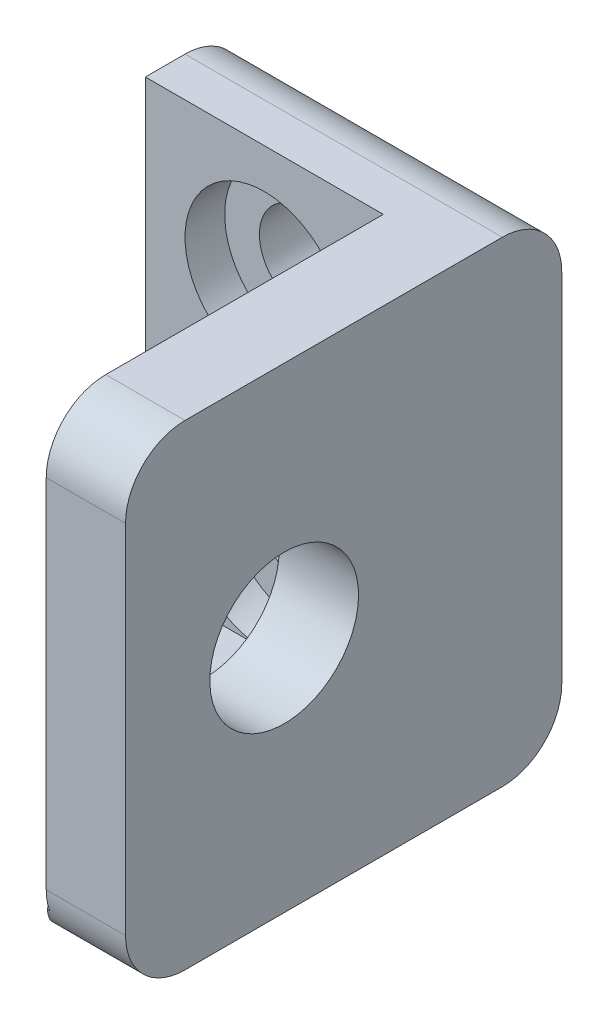
ISO-10303-21;
HEADER;
FILE_DESCRIPTION(('STEP AP214'),'2;1');
FILE_NAME('part.step','',(''),(''),'','','');
FILE_SCHEMA(('AUTOMOTIVE_DESIGN { 1 0 10303 214 1 1 1 1 }'));
ENDSEC;
DATA;
#1=APPLICATION_CONTEXT('core data for automotive mechanical design processes');
#2=APPLICATION_PROTOCOL_DEFINITION('international standard','automotive_design',2000,#1);
#3=PRODUCT_CONTEXT('',#1,'mechanical');
#4=PRODUCT('Part','Part','',(#3));
#5=PRODUCT_RELATED_PRODUCT_CATEGORY('part','',(#4));
#6=PRODUCT_DEFINITION_FORMATION('','',#4);
#7=PRODUCT_DEFINITION_CONTEXT('part definition',#1,'design');
#8=PRODUCT_DEFINITION('design','',#6,#7);
#9=PRODUCT_DEFINITION_SHAPE('','',#8);
#10=(LENGTH_UNIT() NAMED_UNIT(*) SI_UNIT(.MILLI.,.METRE.));
#11=(NAMED_UNIT(*) PLANE_ANGLE_UNIT() SI_UNIT($,.RADIAN.));
#12=(NAMED_UNIT(*) SI_UNIT($,.STERADIAN.) SOLID_ANGLE_UNIT());
#13=UNCERTAINTY_MEASURE_WITH_UNIT(LENGTH_MEASURE(1.E-05),#10,'distance_accuracy_value','');
#14=(GEOMETRIC_REPRESENTATION_CONTEXT(3) GLOBAL_UNCERTAINTY_ASSIGNED_CONTEXT((#13)) GLOBAL_UNIT_ASSIGNED_CONTEXT((#10,
#11,#12)) REPRESENTATION_CONTEXT('',''));
#15=CARTESIAN_POINT('',(0.,0.,0.));
#16=DIRECTION('',(0.,0.,1.));
#17=DIRECTION('',(1.,0.,0.));
#18=AXIS2_PLACEMENT_3D('',#15,#16,#17);
#19=CARTESIAN_POINT('',(-2.,-6.,5.));
#20=DIRECTION('',(0.,0.,-1.));
#21=DIRECTION('',(-1.,0.,0.));
#22=AXIS2_PLACEMENT_3D('',#19,#20,#21);
#23=CYLINDRICAL_SURFACE('',#22,2.25);
#24=CARTESIAN_POINT('',(-2.,-6.,0.));
#25=DIRECTION('',(0.,0.,1.));
#26=DIRECTION('',(1.,0.,0.));
#27=AXIS2_PLACEMENT_3D('',#24,#25,#26);
#28=CIRCLE('',#27,2.25);
#29=CARTESIAN_POINT('',(0.249999999999999,-6.,0.));
#30=VERTEX_POINT('',#29);
#31=EDGE_CURVE('E242',#30,#30,#28,.T.);
#32=ORIENTED_EDGE('',*,*,#31,.F.);
#33=EDGE_LOOP('',(#32));
#34=FACE_BOUND('',#33,.T.);
#35=CARTESIAN_POINT('',(-2.,-6.,3.));
#36=DIRECTION('',(0.,0.,1.));
#37=DIRECTION('',(1.,0.,0.));
#38=AXIS2_PLACEMENT_3D('',#35,#36,#37);
#39=CIRCLE('',#38,2.25);
#40=CARTESIAN_POINT('',(0.249999999999999,-6.,3.));
#41=VERTEX_POINT('',#40);
#42=EDGE_CURVE('E36',#41,#41,#39,.T.);
#43=ORIENTED_EDGE('',*,*,#42,.T.);
#44=EDGE_LOOP('',(#43));
#45=FACE_BOUND('',#44,.T.);
#46=ADVANCED_FACE('F32',(#34,#45),#23,.F.);
#47=CARTESIAN_POINT('',(-2.,6.,5.));
#48=DIRECTION('',(0.,0.,-1.));
#49=DIRECTION('',(-1.,0.,0.));
#50=AXIS2_PLACEMENT_3D('',#47,#48,#49);
#51=CYLINDRICAL_SURFACE('',#50,2.25);
#52=CARTESIAN_POINT('',(-2.,6.,0.));
#53=DIRECTION('',(0.,0.,1.));
#54=DIRECTION('',(1.,0.,0.));
#55=AXIS2_PLACEMENT_3D('',#52,#53,#54);
#56=CIRCLE('',#55,2.25);
#57=CARTESIAN_POINT('',(0.249999999999999,6.,0.));
#58=VERTEX_POINT('',#57);
#59=EDGE_CURVE('E162',#58,#58,#56,.T.);
#60=ORIENTED_EDGE('',*,*,#59,.F.);
#61=EDGE_LOOP('',(#60));
#62=FACE_BOUND('',#61,.T.);
#63=CARTESIAN_POINT('',(-2.,6.,3.));
#64=DIRECTION('',(0.,0.,1.));
#65=DIRECTION('',(1.,0.,0.));
#66=AXIS2_PLACEMENT_3D('',#63,#64,#65);
#67=CIRCLE('',#66,2.25);
#68=CARTESIAN_POINT('',(0.249999999999999,6.,3.));
#69=VERTEX_POINT('',#68);
#70=EDGE_CURVE('E211',#69,#69,#67,.T.);
#71=ORIENTED_EDGE('',*,*,#70,.T.);
#72=EDGE_LOOP('',(#71));
#73=FACE_BOUND('',#72,.T.);
#74=ADVANCED_FACE('F250',(#62,#73),#51,.F.);
#75=CARTESIAN_POINT('',(0.,0.,5.));
#76=DIRECTION('',(0.,0.,-1.));
#77=DIRECTION('',(-1.,0.,0.));
#78=AXIS2_PLACEMENT_3D('',#75,#76,#77);
#79=PLANE('',#78);
#80=CARTESIAN_POINT('',(-2.,6.,5.));
#81=DIRECTION('',(0.,0.,1.));
#82=DIRECTION('',(1.,0.,0.));
#83=AXIS2_PLACEMENT_3D('',#80,#81,#82);
#84=CIRCLE('',#83,4.);
#85=CARTESIAN_POINT('',(2.,6.,5.));
#86=VERTEX_POINT('',#85);
#87=EDGE_CURVE('E219',#86,#86,#84,.T.);
#88=ORIENTED_EDGE('',*,*,#87,.F.);
#89=EDGE_LOOP('',(#88));
#90=FACE_BOUND('',#89,.T.);
#91=DIRECTION('',(1.,0.,0.));
#92=VECTOR('',#91,1.);
#93=CARTESIAN_POINT('',(-8.,-10.,5.));
#94=LINE('',#93,#92);
#95=CARTESIAN_POINT('',(-8.,-10.,5.));
#96=VERTEX_POINT('',#95);
#97=CARTESIAN_POINT('',(-2.,-10.,5.));
#98=VERTEX_POINT('',#97);
#99=EDGE_CURVE('E132',#96,#98,#94,.T.);
#100=ORIENTED_EDGE('',*,*,#99,.T.);
#101=CARTESIAN_POINT('',(-2.,-6.,5.));
#102=DIRECTION('',(0.,0.,1.));
#103=DIRECTION('',(1.,0.,0.));
#104=AXIS2_PLACEMENT_3D('',#101,#102,#103);
#105=CIRCLE('',#104,4.);
#106=EDGE_CURVE('E47',#98,#98,#105,.T.);
#107=ORIENTED_EDGE('',*,*,#106,.F.);
#108=CARTESIAN_POINT('',(4.,-10.,5.));
#109=VERTEX_POINT('',#108);
#110=EDGE_CURVE('E127',#98,#109,#94,.T.);
#111=ORIENTED_EDGE('',*,*,#110,.T.);
#112=DIRECTION('',(0.,1.,0.));
#113=VECTOR('',#112,1.);
#114=CARTESIAN_POINT('',(4.,0.,5.));
#115=LINE('',#114,#113);
#116=CARTESIAN_POINT('',(4.,12.,5.));
#117=VERTEX_POINT('',#116);
#118=EDGE_CURVE('E240',#109,#117,#115,.T.);
#119=ORIENTED_EDGE('',*,*,#118,.T.);
#120=DIRECTION('',(-1.,0.,0.));
#121=VECTOR('',#120,1.);
#122=CARTESIAN_POINT('',(8.,12.,5.));
#123=LINE('',#122,#121);
#124=CARTESIAN_POINT('',(-8.,12.,5.));
#125=VERTEX_POINT('',#124);
#126=EDGE_CURVE('E149',#117,#125,#123,.T.);
#127=ORIENTED_EDGE('',*,*,#126,.T.);
#128=DIRECTION('',(0.,-1.,0.));
#129=VECTOR('',#128,1.);
#130=CARTESIAN_POINT('',(-8.,12.,5.));
#131=LINE('',#130,#129);
#132=EDGE_CURVE('E142',#125,#96,#131,.T.);
#133=ORIENTED_EDGE('',*,*,#132,.T.);
#134=EDGE_LOOP('',(#100,#107,#111,#119,#127,#133));
#135=FACE_BOUND('',#134,.T.);
#136=ADVANCED_FACE('F147',(#90,#135),#79,.F.);
#137=CARTESIAN_POINT('',(0.,0.,0.));
#138=DIRECTION('',(0.,0.,-1.));
#139=DIRECTION('',(-1.,0.,0.));
#140=AXIS2_PLACEMENT_3D('',#137,#138,#139);
#141=PLANE('',#140);
#142=DIRECTION('',(0.,-1.,0.));
#143=VECTOR('',#142,1.);
#144=CARTESIAN_POINT('',(-8.,12.,0.));
#145=LINE('',#144,#143);
#146=CARTESIAN_POINT('',(-8.,9.,0.));
#147=VERTEX_POINT('',#146);
#148=CARTESIAN_POINT('',(-8.,-9.,0.));
#149=VERTEX_POINT('',#148);
#150=EDGE_CURVE('E155',#147,#149,#145,.T.);
#151=ORIENTED_EDGE('',*,*,#150,.F.);
#152=DIRECTION('',(-1.,0.,0.));
#153=VECTOR('',#152,1.);
#154=CARTESIAN_POINT('',(8.,9.00000000000001,0.));
#155=LINE('',#154,#153);
#156=CARTESIAN_POINT('',(8.,9.00000000000001,0.));
#157=VERTEX_POINT('',#156);
#158=EDGE_CURVE('E186',#147,#157,#155,.F.);
#159=ORIENTED_EDGE('',*,*,#158,.T.);
#160=DIRECTION('',(0.,1.,0.));
#161=VECTOR('',#160,1.);
#162=CARTESIAN_POINT('',(8.,12.,0.));
#163=LINE('',#162,#161);
#164=CARTESIAN_POINT('',(8.,-9.,0.));
#165=VERTEX_POINT('',#164);
#166=EDGE_CURVE('E159',#165,#157,#163,.T.);
#167=ORIENTED_EDGE('',*,*,#166,.F.);
#168=DIRECTION('',(1.,0.,0.));
#169=VECTOR('',#168,1.);
#170=CARTESIAN_POINT('',(-8.,-9.,0.));
#171=LINE('',#170,#169);
#172=EDGE_CURVE('E184',#165,#149,#171,.F.);
#173=ORIENTED_EDGE('',*,*,#172,.T.);
#174=EDGE_LOOP('',(#151,#159,#167,#173));
#175=FACE_BOUND('',#174,.T.);
#176=ORIENTED_EDGE('',*,*,#59,.T.);
#177=EDGE_LOOP('',(#176));
#178=FACE_BOUND('',#177,.T.);
#179=ORIENTED_EDGE('',*,*,#31,.T.);
#180=EDGE_LOOP('',(#179));
#181=FACE_BOUND('',#180,.T.);
#182=ADVANCED_FACE('F247',(#175,#178,#181),#141,.T.);
#183=CARTESIAN_POINT('',(8.,12.,5.));
#184=DIRECTION('',(-1.,0.,0.));
#185=DIRECTION('',(0.,-1.,0.));
#186=AXIS2_PLACEMENT_3D('',#183,#184,#185);
#187=PLANE('',#186);
#188=CARTESIAN_POINT('',(8.,0.,14.));
#189=DIRECTION('',(1.,0.,0.));
#190=DIRECTION('',(0.,1.,0.));
#191=AXIS2_PLACEMENT_3D('',#188,#189,#190);
#192=CIRCLE('',#191,3.75);
#193=CARTESIAN_POINT('',(8.,3.75,14.));
#194=VERTEX_POINT('',#193);
#195=EDGE_CURVE('E145',#194,#194,#192,.T.);
#196=ORIENTED_EDGE('',*,*,#195,.F.);
#197=EDGE_LOOP('',(#196));
#198=FACE_BOUND('',#197,.T.);
#199=ORIENTED_EDGE('',*,*,#166,.T.);
#200=CARTESIAN_POINT('',(8.,9.00000000000001,3.));
#201=DIRECTION('',(-1.,0.,0.));
#202=DIRECTION('',(0.,-1.,0.));
#203=AXIS2_PLACEMENT_3D('',#200,#201,#202);
#204=CIRCLE('',#203,3.);
#205=CARTESIAN_POINT('',(8.,12.,3.));
#206=VERTEX_POINT('',#205);
#207=EDGE_CURVE('E194',#157,#206,#204,.F.);
#208=ORIENTED_EDGE('',*,*,#207,.T.);
#209=DIRECTION('',(0.,0.,-1.));
#210=VECTOR('',#209,1.);
#211=CARTESIAN_POINT('',(8.,12.,5.));
#212=LINE('',#211,#210);
#213=CARTESIAN_POINT('',(8.,12.,19.));
#214=VERTEX_POINT('',#213);
#215=EDGE_CURVE('E168',#214,#206,#212,.T.);
#216=ORIENTED_EDGE('',*,*,#215,.F.);
#217=CARTESIAN_POINT('',(8.,9.00000000000001,19.));
#218=DIRECTION('',(-1.,0.,0.));
#219=DIRECTION('',(0.,-1.,0.));
#220=AXIS2_PLACEMENT_3D('',#217,#218,#219);
#221=CIRCLE('',#220,3.);
#222=CARTESIAN_POINT('',(8.,9.00000000000001,22.));
#223=VERTEX_POINT('',#222);
#224=EDGE_CURVE('E192',#214,#223,#221,.F.);
#225=ORIENTED_EDGE('',*,*,#224,.T.);
#226=DIRECTION('',(0.,1.,0.));
#227=VECTOR('',#226,1.);
#228=CARTESIAN_POINT('',(8.,12.,22.));
#229=LINE('',#228,#227);
#230=CARTESIAN_POINT('',(8.,-9.,22.));
#231=VERTEX_POINT('',#230);
#232=EDGE_CURVE('E234',#231,#223,#229,.T.);
#233=ORIENTED_EDGE('',*,*,#232,.F.);
#234=CARTESIAN_POINT('',(8.,-9.,19.));
#235=DIRECTION('',(-1.,0.,0.));
#236=DIRECTION('',(0.,-1.,0.));
#237=AXIS2_PLACEMENT_3D('',#234,#235,#236);
#238=CIRCLE('',#237,3.);
#239=CARTESIAN_POINT('',(8.,-12.,19.));
#240=VERTEX_POINT('',#239);
#241=EDGE_CURVE('E190',#231,#240,#238,.F.);
#242=ORIENTED_EDGE('',*,*,#241,.T.);
#243=DIRECTION('',(0.,0.,-1.));
#244=VECTOR('',#243,1.);
#245=CARTESIAN_POINT('',(8.,-12.,5.));
#246=LINE('',#245,#244);
#247=CARTESIAN_POINT('',(8.,-12.,3.));
#248=VERTEX_POINT('',#247);
#249=EDGE_CURVE('E151',#240,#248,#246,.T.);
#250=ORIENTED_EDGE('',*,*,#249,.T.);
#251=CARTESIAN_POINT('',(8.,-9.,3.));
#252=DIRECTION('',(-1.,0.,0.));
#253=DIRECTION('',(0.,-1.,0.));
#254=AXIS2_PLACEMENT_3D('',#251,#252,#253);
#255=CIRCLE('',#254,3.);
#256=EDGE_CURVE('E188',#248,#165,#255,.F.);
#257=ORIENTED_EDGE('',*,*,#256,.T.);
#258=EDGE_LOOP('',(#199,#208,#216,#225,#233,#242,#250,#257));
#259=FACE_BOUND('',#258,.T.);
#260=ADVANCED_FACE('F265',(#198,#259),#187,.F.);
#261=CARTESIAN_POINT('',(8.,12.,5.));
#262=DIRECTION('',(0.,-1.,0.));
#263=DIRECTION('',(1.,0.,0.));
#264=AXIS2_PLACEMENT_3D('',#261,#262,#263);
#265=PLANE('',#264);
#266=ORIENTED_EDGE('',*,*,#215,.T.);
#267=DIRECTION('',(-1.,0.,0.));
#268=VECTOR('',#267,1.);
#269=CARTESIAN_POINT('',(-8.,12.,3.));
#270=LINE('',#269,#268);
#271=CARTESIAN_POINT('',(-8.,12.,3.));
#272=VERTEX_POINT('',#271);
#273=EDGE_CURVE('E177',#206,#272,#270,.T.);
#274=ORIENTED_EDGE('',*,*,#273,.T.);
#275=DIRECTION('',(0.,0.,-1.));
#276=VECTOR('',#275,1.);
#277=CARTESIAN_POINT('',(-8.,12.,5.));
#278=LINE('',#277,#276);
#279=EDGE_CURVE('E166',#125,#272,#278,.T.);
#280=ORIENTED_EDGE('',*,*,#279,.F.);
#281=ORIENTED_EDGE('',*,*,#126,.F.);
#282=DIRECTION('',(0.,0.,1.));
#283=VECTOR('',#282,1.);
#284=CARTESIAN_POINT('',(4.,12.,-24.3310501211929));
#285=LINE('',#284,#283);
#286=CARTESIAN_POINT('',(4.,12.,19.));
#287=VERTEX_POINT('',#286);
#288=EDGE_CURVE('E237',#117,#287,#285,.T.);
#289=ORIENTED_EDGE('',*,*,#288,.T.);
#290=DIRECTION('',(-1.,0.,0.));
#291=VECTOR('',#290,1.);
#292=CARTESIAN_POINT('',(8.,12.,19.));
#293=LINE('',#292,#291);
#294=EDGE_CURVE('E171',#287,#214,#293,.F.);
#295=ORIENTED_EDGE('',*,*,#294,.T.);
#296=EDGE_LOOP('',(#266,#274,#280,#281,#289,#295));
#297=FACE_BOUND('',#296,.T.);
#298=ADVANCED_FACE('F274',(#297),#265,.F.);
#299=CARTESIAN_POINT('',(-8.,12.,5.));
#300=DIRECTION('',(1.,0.,0.));
#301=DIRECTION('',(0.,1.,0.));
#302=AXIS2_PLACEMENT_3D('',#299,#300,#301);
#303=PLANE('',#302);
#304=ORIENTED_EDGE('',*,*,#279,.T.);
#305=CARTESIAN_POINT('',(-8.,9.,3.));
#306=DIRECTION('',(1.,0.,0.));
#307=DIRECTION('',(0.,1.,0.));
#308=AXIS2_PLACEMENT_3D('',#305,#306,#307);
#309=CIRCLE('',#308,3.);
#310=EDGE_CURVE('E182',#272,#147,#309,.F.);
#311=ORIENTED_EDGE('',*,*,#310,.T.);
#312=ORIENTED_EDGE('',*,*,#150,.T.);
#313=CARTESIAN_POINT('',(-8.,-9.,3.));
#314=DIRECTION('',(1.,0.,0.));
#315=DIRECTION('',(0.,1.,0.));
#316=AXIS2_PLACEMENT_3D('',#313,#314,#315);
#317=CIRCLE('',#316,3.);
#318=CARTESIAN_POINT('',(-8.,-12.,3.));
#319=VERTEX_POINT('',#318);
#320=EDGE_CURVE('E180',#149,#319,#317,.F.);
#321=ORIENTED_EDGE('',*,*,#320,.T.);
#322=DIRECTION('',(0.,0.,-1.));
#323=VECTOR('',#322,1.);
#324=CARTESIAN_POINT('',(-8.,-12.,5.));
#325=LINE('',#324,#323);
#326=CARTESIAN_POINT('',(-8.,-12.,5.));
#327=VERTEX_POINT('',#326);
#328=EDGE_CURVE('E144',#327,#319,#325,.T.);
#329=ORIENTED_EDGE('',*,*,#328,.F.);
#330=DIRECTION('',(0.,-1.,0.));
#331=VECTOR('',#330,1.);
#332=CARTESIAN_POINT('',(-8.,-10.,5.));
#333=LINE('',#332,#331);
#334=EDGE_CURVE('E123',#96,#327,#333,.T.);
#335=ORIENTED_EDGE('',*,*,#334,.F.);
#336=ORIENTED_EDGE('',*,*,#132,.F.);
#337=EDGE_LOOP('',(#304,#311,#312,#321,#329,#335,#336));
#338=FACE_BOUND('',#337,.T.);
#339=ADVANCED_FACE('F141',(#338),#303,.F.);
#340=CARTESIAN_POINT('',(8.,-12.,5.));
#341=DIRECTION('',(0.,1.,0.));
#342=DIRECTION('',(-1.,0.,0.));
#343=AXIS2_PLACEMENT_3D('',#340,#341,#342);
#344=PLANE('',#343);
#345=ORIENTED_EDGE('',*,*,#249,.F.);
#346=DIRECTION('',(1.,0.,0.));
#347=VECTOR('',#346,1.);
#348=CARTESIAN_POINT('',(4.,-12.,19.));
#349=LINE('',#348,#347);
#350=CARTESIAN_POINT('',(1.88235294117647,-12.,19.));
#351=VERTEX_POINT('',#350);
#352=EDGE_CURVE('E209',#240,#351,#349,.F.);
#353=ORIENTED_EDGE('',*,*,#352,.T.);
#354=DIRECTION('',(-0.576683197598655,0.,-0.816967863264762));
#355=VECTOR('',#354,1.);
#356=CARTESIAN_POINT('',(4.,-12.,22.));
#357=LINE('',#356,#355);
#358=EDGE_CURVE('E213',#351,#327,#357,.T.);
#359=ORIENTED_EDGE('',*,*,#358,.T.);
#360=ORIENTED_EDGE('',*,*,#328,.T.);
#361=DIRECTION('',(1.,0.,0.));
#362=VECTOR('',#361,1.);
#363=CARTESIAN_POINT('',(8.,-12.,3.));
#364=LINE('',#363,#362);
#365=EDGE_CURVE('E206',#319,#248,#364,.T.);
#366=ORIENTED_EDGE('',*,*,#365,.T.);
#367=EDGE_LOOP('',(#345,#353,#359,#360,#366));
#368=FACE_BOUND('',#367,.T.);
#369=ADVANCED_FACE('F267',(#368),#344,.F.);
#370=CARTESIAN_POINT('',(4.,12.,-24.3310501211929));
#371=DIRECTION('',(-1.,0.,0.));
#372=DIRECTION('',(0.,-1.,0.));
#373=AXIS2_PLACEMENT_3D('',#370,#371,#372);
#374=PLANE('',#373);
#375=DIRECTION('',(0.,-1.,0.));
#376=VECTOR('',#375,1.);
#377=CARTESIAN_POINT('',(4.,12.,22.));
#378=LINE('',#377,#376);
#379=CARTESIAN_POINT('',(4.,9.00000000000001,22.));
#380=VERTEX_POINT('',#379);
#381=CARTESIAN_POINT('',(4.,-9.,22.));
#382=VERTEX_POINT('',#381);
#383=EDGE_CURVE('E175',#380,#382,#378,.T.);
#384=ORIENTED_EDGE('',*,*,#383,.F.);
#385=CARTESIAN_POINT('',(4.,9.00000000000001,19.));
#386=DIRECTION('',(-1.,0.,0.));
#387=DIRECTION('',(0.,-1.,0.));
#388=AXIS2_PLACEMENT_3D('',#385,#386,#387);
#389=CIRCLE('',#388,3.);
#390=EDGE_CURVE('E204',#380,#287,#389,.T.);
#391=ORIENTED_EDGE('',*,*,#390,.T.);
#392=ORIENTED_EDGE('',*,*,#288,.F.);
#393=ORIENTED_EDGE('',*,*,#118,.F.);
#394=DIRECTION('',(0.,0.,1.));
#395=VECTOR('',#394,1.);
#396=CARTESIAN_POINT('',(4.,-10.,5.));
#397=LINE('',#396,#395);
#398=CARTESIAN_POINT('',(4.,-10.,21.8284271247462));
#399=VERTEX_POINT('',#398);
#400=EDGE_CURVE('E128',#109,#399,#397,.T.);
#401=ORIENTED_EDGE('',*,*,#400,.T.);
#402=CARTESIAN_POINT('',(4.,-9.,19.));
#403=DIRECTION('',(-1.,0.,0.));
#404=DIRECTION('',(0.,-1.,0.));
#405=AXIS2_PLACEMENT_3D('',#402,#403,#404);
#406=CIRCLE('',#405,3.);
#407=EDGE_CURVE('E202',#399,#382,#406,.T.);
#408=ORIENTED_EDGE('',*,*,#407,.T.);
#409=EDGE_LOOP('',(#384,#391,#392,#393,#401,#408));
#410=FACE_BOUND('',#409,.T.);
#411=CARTESIAN_POINT('',(4.,0.,14.));
#412=DIRECTION('',(-1.,0.,0.));
#413=DIRECTION('',(0.,-1.,0.));
#414=AXIS2_PLACEMENT_3D('',#411,#412,#413);
#415=CIRCLE('',#414,3.75);
#416=CARTESIAN_POINT('',(4.,-3.75,14.));
#417=VERTEX_POINT('',#416);
#418=EDGE_CURVE('E172',#417,#417,#415,.T.);
#419=ORIENTED_EDGE('',*,*,#418,.F.);
#420=EDGE_LOOP('',(#419));
#421=FACE_BOUND('',#420,.T.);
#422=ADVANCED_FACE('F270',(#410,#421),#374,.T.);
#423=CARTESIAN_POINT('',(0.,0.,22.));
#424=DIRECTION('',(0.,0.,1.));
#425=DIRECTION('',(1.,0.,0.));
#426=AXIS2_PLACEMENT_3D('',#423,#424,#425);
#427=PLANE('',#426);
#428=ORIENTED_EDGE('',*,*,#232,.T.);
#429=DIRECTION('',(-1.,0.,0.));
#430=VECTOR('',#429,1.);
#431=CARTESIAN_POINT('',(4.,9.00000000000001,22.));
#432=LINE('',#431,#430);
#433=EDGE_CURVE('E199',#223,#380,#432,.T.);
#434=ORIENTED_EDGE('',*,*,#433,.T.);
#435=ORIENTED_EDGE('',*,*,#383,.T.);
#436=DIRECTION('',(1.,0.,0.));
#437=VECTOR('',#436,1.);
#438=CARTESIAN_POINT('',(8.,-9.,22.));
#439=LINE('',#438,#437);
#440=EDGE_CURVE('E196',#382,#231,#439,.T.);
#441=ORIENTED_EDGE('',*,*,#440,.T.);
#442=EDGE_LOOP('',(#428,#434,#435,#441));
#443=FACE_BOUND('',#442,.T.);
#444=ADVANCED_FACE('F336',(#443),#427,.T.);
#445=CARTESIAN_POINT('',(-8.,0.,14.));
#446=DIRECTION('',(1.,0.,0.));
#447=DIRECTION('',(0.,1.,0.));
#448=AXIS2_PLACEMENT_3D('',#445,#446,#447);
#449=CYLINDRICAL_SURFACE('',#448,3.75);
#450=ORIENTED_EDGE('',*,*,#418,.T.);
#451=EDGE_LOOP('',(#450));
#452=FACE_BOUND('',#451,.T.);
#453=ORIENTED_EDGE('',*,*,#195,.T.);
#454=EDGE_LOOP('',(#453));
#455=FACE_BOUND('',#454,.T.);
#456=ADVANCED_FACE('F333',(#452,#455),#449,.F.);
#457=CARTESIAN_POINT('',(4.,-10.,22.));
#458=DIRECTION('',(-0.816967863264762,0.,0.576683197598655));
#459=DIRECTION('',(0.576683197598655,0.,0.816967863264762));
#460=AXIS2_PLACEMENT_3D('',#457,#458,#459);
#461=PLANE('',#460);
#462=ORIENTED_EDGE('',*,*,#358,.F.);
#463=CARTESIAN_POINT('',(1.88235294117647,-9.,19.));
#464=DIRECTION('',(-0.816967863264762,0.,0.576683197598655));
#465=DIRECTION('',(-0.576683197598655,0.,-0.816967863264762));
#466=AXIS2_PLACEMENT_3D('',#463,#464,#465);
#467=ELLIPSE('',#466,3.67211506706203,3.);
#468=CARTESIAN_POINT('',(3.87888973511496,-10.,21.8284271247462));
#469=VERTEX_POINT('',#468);
#470=EDGE_CURVE('E41',#351,#469,#467,.T.);
#471=ORIENTED_EDGE('',*,*,#470,.T.);
#472=DIRECTION('',(-0.576683197598655,0.,-0.816967863264762));
#473=VECTOR('',#472,1.);
#474=CARTESIAN_POINT('',(4.,-10.,22.));
#475=LINE('',#474,#473);
#476=EDGE_CURVE('E119',#469,#96,#475,.T.);
#477=ORIENTED_EDGE('',*,*,#476,.T.);
#478=ORIENTED_EDGE('',*,*,#334,.T.);
#479=EDGE_LOOP('',(#462,#471,#477,#478));
#480=FACE_BOUND('',#479,.T.);
#481=ADVANCED_FACE('F121',(#480),#461,.T.);
#482=CARTESIAN_POINT('',(0.,-10.,0.));
#483=DIRECTION('',(0.,1.,0.));
#484=DIRECTION('',(-1.,0.,0.));
#485=AXIS2_PLACEMENT_3D('',#482,#483,#484);
#486=PLANE('',#485);
#487=ORIENTED_EDGE('',*,*,#476,.F.);
#488=DIRECTION('',(-1.,0.,0.));
#489=VECTOR('',#488,1.);
#490=CARTESIAN_POINT('',(3.87888973511496,-10.,21.8284271247462));
#491=LINE('',#490,#489);
#492=EDGE_CURVE('E11',#469,#399,#491,.F.);
#493=ORIENTED_EDGE('',*,*,#492,.T.);
#494=ORIENTED_EDGE('',*,*,#400,.F.);
#495=ORIENTED_EDGE('',*,*,#110,.F.);
#496=ORIENTED_EDGE('',*,*,#99,.F.);
#497=EDGE_LOOP('',(#487,#493,#494,#495,#496));
#498=FACE_BOUND('',#497,.T.);
#499=ADVANCED_FACE('F133',(#498),#486,.T.);
#500=CARTESIAN_POINT('',(8.,9.00000000000001,3.));
#501=DIRECTION('',(1.,0.,0.));
#502=DIRECTION('',(0.,1.,0.));
#503=AXIS2_PLACEMENT_3D('',#500,#501,#502);
#504=CYLINDRICAL_SURFACE('',#503,3.);
#505=ORIENTED_EDGE('',*,*,#207,.F.);
#506=ORIENTED_EDGE('',*,*,#158,.F.);
#507=ORIENTED_EDGE('',*,*,#310,.F.);
#508=ORIENTED_EDGE('',*,*,#273,.F.);
#509=EDGE_LOOP('',(#505,#506,#507,#508));
#510=FACE_BOUND('',#509,.T.);
#511=ADVANCED_FACE('F281',(#510),#504,.T.);
#512=CARTESIAN_POINT('',(0.,9.,19.));
#513=DIRECTION('',(1.,0.,0.));
#514=DIRECTION('',(0.,1.,0.));
#515=AXIS2_PLACEMENT_3D('',#512,#513,#514);
#516=CYLINDRICAL_SURFACE('',#515,3.);
#517=ORIENTED_EDGE('',*,*,#224,.F.);
#518=ORIENTED_EDGE('',*,*,#294,.F.);
#519=ORIENTED_EDGE('',*,*,#390,.F.);
#520=ORIENTED_EDGE('',*,*,#433,.F.);
#521=EDGE_LOOP('',(#517,#518,#519,#520));
#522=FACE_BOUND('',#521,.T.);
#523=ADVANCED_FACE('F284',(#522),#516,.T.);
#524=CARTESIAN_POINT('',(0.,-9.,19.));
#525=DIRECTION('',(-1.,0.,0.));
#526=DIRECTION('',(0.,-1.,0.));
#527=AXIS2_PLACEMENT_3D('',#524,#525,#526);
#528=CYLINDRICAL_SURFACE('',#527,3.);
#529=ORIENTED_EDGE('',*,*,#470,.F.);
#530=ORIENTED_EDGE('',*,*,#352,.F.);
#531=ORIENTED_EDGE('',*,*,#241,.F.);
#532=ORIENTED_EDGE('',*,*,#440,.F.);
#533=ORIENTED_EDGE('',*,*,#407,.F.);
#534=ORIENTED_EDGE('',*,*,#492,.F.);
#535=EDGE_LOOP('',(#529,#530,#531,#532,#533,#534));
#536=FACE_BOUND('',#535,.T.);
#537=ADVANCED_FACE('F287',(#536),#528,.T.);
#538=CARTESIAN_POINT('',(8.,-9.,3.));
#539=DIRECTION('',(-1.,0.,0.));
#540=DIRECTION('',(0.,-1.,0.));
#541=AXIS2_PLACEMENT_3D('',#538,#539,#540);
#542=CYLINDRICAL_SURFACE('',#541,3.);
#543=ORIENTED_EDGE('',*,*,#320,.F.);
#544=ORIENTED_EDGE('',*,*,#172,.F.);
#545=ORIENTED_EDGE('',*,*,#256,.F.);
#546=ORIENTED_EDGE('',*,*,#365,.F.);
#547=EDGE_LOOP('',(#543,#544,#545,#546));
#548=FACE_BOUND('',#547,.T.);
#549=ADVANCED_FACE('F34',(#548),#542,.T.);
#550=CARTESIAN_POINT('',(-2.,6.,3.));
#551=DIRECTION('',(0.,0.,1.));
#552=DIRECTION('',(1.,0.,0.));
#553=AXIS2_PLACEMENT_3D('',#550,#551,#552);
#554=CYLINDRICAL_SURFACE('',#553,4.);
#555=CARTESIAN_POINT('',(-2.,6.,3.));
#556=DIRECTION('',(0.,0.,1.));
#557=DIRECTION('',(1.,0.,0.));
#558=AXIS2_PLACEMENT_3D('',#555,#556,#557);
#559=CIRCLE('',#558,4.);
#560=CARTESIAN_POINT('',(2.,6.,3.));
#561=VERTEX_POINT('',#560);
#562=EDGE_CURVE('E214',#561,#561,#559,.T.);
#563=ORIENTED_EDGE('',*,*,#562,.F.);
#564=EDGE_LOOP('',(#563));
#565=FACE_BOUND('',#564,.T.);
#566=ORIENTED_EDGE('',*,*,#87,.T.);
#567=EDGE_LOOP('',(#566));
#568=FACE_BOUND('',#567,.T.);
#569=ADVANCED_FACE('F294',(#565,#568),#554,.F.);
#570=CARTESIAN_POINT('',(-2.,6.,3.));
#571=DIRECTION('',(0.,0.,1.));
#572=DIRECTION('',(1.,0.,0.));
#573=AXIS2_PLACEMENT_3D('',#570,#571,#572);
#574=PLANE('',#573);
#575=ORIENTED_EDGE('',*,*,#70,.F.);
#576=EDGE_LOOP('',(#575));
#577=FACE_BOUND('',#576,.T.);
#578=ORIENTED_EDGE('',*,*,#562,.T.);
#579=EDGE_LOOP('',(#578));
#580=FACE_BOUND('',#579,.T.);
#581=ADVANCED_FACE('F319',(#577,#580),#574,.T.);
#582=CARTESIAN_POINT('',(-2.,-6.,3.));
#583=DIRECTION('',(0.,0.,1.));
#584=DIRECTION('',(1.,0.,0.));
#585=AXIS2_PLACEMENT_3D('',#582,#583,#584);
#586=CYLINDRICAL_SURFACE('',#585,4.);
#587=CARTESIAN_POINT('',(-2.,-6.,3.));
#588=DIRECTION('',(0.,0.,1.));
#589=DIRECTION('',(1.,0.,0.));
#590=AXIS2_PLACEMENT_3D('',#587,#588,#589);
#591=CIRCLE('',#590,4.);
#592=CARTESIAN_POINT('',(2.,-6.,3.));
#593=VERTEX_POINT('',#592);
#594=EDGE_CURVE('E304',#593,#593,#591,.T.);
#595=ORIENTED_EDGE('',*,*,#594,.F.);
#596=EDGE_LOOP('',(#595));
#597=FACE_BOUND('',#596,.T.);
#598=ORIENTED_EDGE('',*,*,#106,.T.);
#599=EDGE_LOOP('',(#598));
#600=FACE_BOUND('',#599,.T.);
#601=ADVANCED_FACE('F314',(#597,#600),#586,.F.);
#602=CARTESIAN_POINT('',(-2.,-6.,3.));
#603=DIRECTION('',(0.,0.,1.));
#604=DIRECTION('',(1.,0.,0.));
#605=AXIS2_PLACEMENT_3D('',#602,#603,#604);
#606=PLANE('',#605);
#607=ORIENTED_EDGE('',*,*,#42,.F.);
#608=EDGE_LOOP('',(#607));
#609=FACE_BOUND('',#608,.T.);
#610=ORIENTED_EDGE('',*,*,#594,.T.);
#611=EDGE_LOOP('',(#610));
#612=FACE_BOUND('',#611,.T.);
#613=ADVANCED_FACE('F312',(#609,#612),#606,.T.);
#614=CLOSED_SHELL('',(#46,#74,#136,#182,#260,#298,#339,#369,#422,#444,#456,#481,#499,#511,#523,
#537,#549,#569,#581,#601,#613));
#615=MANIFOLD_SOLID_BREP('B2',#614);
#616=ADVANCED_BREP_SHAPE_REPRESENTATION('',(#18,#615),#14);
#617=SHAPE_DEFINITION_REPRESENTATION(#9,#616);
ENDSEC;
END-ISO-10303-21;
